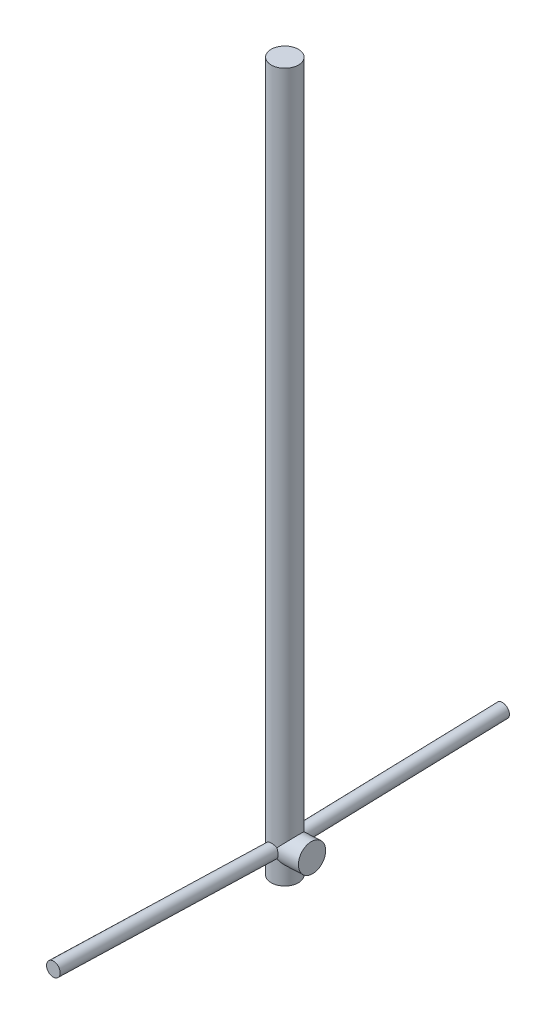
ISO-10303-21;
HEADER;
FILE_DESCRIPTION(('STEP AP214'),'2;1');
FILE_NAME('part.step','',(''),(''),'','','');
FILE_SCHEMA(('AUTOMOTIVE_DESIGN { 1 0 10303 214 1 1 1 1 }'));
ENDSEC;
DATA;
#1=APPLICATION_CONTEXT('core data for automotive mechanical design processes');
#2=APPLICATION_PROTOCOL_DEFINITION('international standard','automotive_design',2000,#1);
#3=PRODUCT_CONTEXT('',#1,'mechanical');
#4=PRODUCT('Part','Part','',(#3));
#5=PRODUCT_RELATED_PRODUCT_CATEGORY('part','',(#4));
#6=PRODUCT_DEFINITION_FORMATION('','',#4);
#7=PRODUCT_DEFINITION_CONTEXT('part definition',#1,'design');
#8=PRODUCT_DEFINITION('design','',#6,#7);
#9=PRODUCT_DEFINITION_SHAPE('','',#8);
#10=(LENGTH_UNIT() NAMED_UNIT(*) SI_UNIT(.MILLI.,.METRE.));
#11=(NAMED_UNIT(*) PLANE_ANGLE_UNIT() SI_UNIT($,.RADIAN.));
#12=(NAMED_UNIT(*) SI_UNIT($,.STERADIAN.) SOLID_ANGLE_UNIT());
#13=UNCERTAINTY_MEASURE_WITH_UNIT(LENGTH_MEASURE(1.E-05),#10,'distance_accuracy_value','');
#14=(GEOMETRIC_REPRESENTATION_CONTEXT(3) GLOBAL_UNCERTAINTY_ASSIGNED_CONTEXT((#13)) GLOBAL_UNIT_ASSIGNED_CONTEXT((#10,
#11,#12)) REPRESENTATION_CONTEXT('',''));
#15=CARTESIAN_POINT('',(0.,0.,0.));
#16=DIRECTION('',(0.,0.,1.));
#17=DIRECTION('',(1.,0.,0.));
#18=AXIS2_PLACEMENT_3D('',#15,#16,#17);
#19=CARTESIAN_POINT('',(0.,-100.,0.));
#20=DIRECTION('',(0.,1.,0.));
#21=DIRECTION('',(0.,0.,1.));
#22=AXIS2_PLACEMENT_3D('',#19,#20,#21);
#23=PLANE('',#22);
#24=CARTESIAN_POINT('',(0.,-100.,0.));
#25=DIRECTION('',(0.,1.,0.));
#26=DIRECTION('',(0.,0.,1.));
#27=AXIS2_PLACEMENT_3D('',#24,#25,#26);
#28=CIRCLE('',#27,50.);
#29=CARTESIAN_POINT('',(0.,-100.,50.));
#30=VERTEX_POINT('',#29);
#31=EDGE_CURVE('E155',#30,#30,#28,.T.);
#32=ORIENTED_EDGE('',*,*,#31,.F.);
#33=EDGE_LOOP('',(#32));
#34=FACE_BOUND('',#33,.T.);
#35=ADVANCED_FACE('F59',(#34),#23,.F.);
#36=CARTESIAN_POINT('',(0.,2500.,0.));
#37=DIRECTION('',(0.,1.,0.));
#38=DIRECTION('',(0.,0.,1.));
#39=AXIS2_PLACEMENT_3D('',#36,#37,#38);
#40=PLANE('',#39);
#41=CARTESIAN_POINT('',(0.,2500.,0.));
#42=DIRECTION('',(0.,1.,0.));
#43=DIRECTION('',(0.,0.,1.));
#44=AXIS2_PLACEMENT_3D('',#41,#42,#43);
#45=CIRCLE('',#44,50.);
#46=CARTESIAN_POINT('',(0.,2500.,50.));
#47=VERTEX_POINT('',#46);
#48=EDGE_CURVE('E158',#47,#47,#45,.T.);
#49=ORIENTED_EDGE('',*,*,#48,.T.);
#50=EDGE_LOOP('',(#49));
#51=FACE_BOUND('',#50,.T.);
#52=ADVANCED_FACE('F151',(#51),#40,.T.);
#53=CARTESIAN_POINT('',(0.,-100.,0.));
#54=DIRECTION('',(0.,1.,0.));
#55=DIRECTION('',(0.,0.,1.));
#56=AXIS2_PLACEMENT_3D('',#53,#54,#55);
#57=CYLINDRICAL_SURFACE('',#56,50.);
#58=CARTESIAN_POINT('',(0.,26.5119330554168,-50.));
#59=CARTESIAN_POINT('',(0.652167768799973,26.5119306936379,-49.9999979292977));
#60=CARTESIAN_POINT('',(1.30438425939995,26.4859875871324,-49.9872100324663));
#61=CARTESIAN_POINT('',(2.60397388038285,26.3825297546256,-49.9363844626733));
#62=CARTESIAN_POINT('',(3.25134474426769,26.3049922550804,-49.8983356396639));
#63=CARTESIAN_POINT('',(4.53716864067537,26.0991474571904,-49.7978982936412));
#64=CARTESIAN_POINT('',(5.17560460201858,25.9707538927765,-49.7354684160989));
#65=CARTESIAN_POINT('',(6.43779058405342,25.6647804984095,-49.5878876097817));
#66=CARTESIAN_POINT('',(7.06154207882814,25.4872056285046,-49.5027389722778));
#67=CARTESIAN_POINT('',(8.28778008375576,25.0857008531938,-49.3122311253799));
#68=CARTESIAN_POINT('',(8.89034451383354,24.8619676080531,-49.206957793641));
#69=CARTESIAN_POINT('',(10.0734424601174,24.3699387185465,-48.9784524443914));
#70=CARTESIAN_POINT('',(10.6539755006106,24.1016421126178,-48.855220039377));
#71=CARTESIAN_POINT('',(11.7899013718175,23.5229225225562,-48.5935993023709));
#72=CARTESIAN_POINT('',(12.3452990770038,23.2125077534485,-48.4552139269353));
#73=CARTESIAN_POINT('',(13.4285607077832,22.5518997760985,-48.1662544525045));
#74=CARTESIAN_POINT('',(13.9564236049864,22.2017050836768,-48.0156798987943));
#75=CARTESIAN_POINT('',(15.0158980621268,21.4398064917419,-47.6953737640189));
#76=CARTESIAN_POINT('',(15.5455134669685,21.0255817121601,-47.525033218668));
#77=CARTESIAN_POINT('',(16.5687734185367,20.1573112228309,-47.1780426439557));
#78=CARTESIAN_POINT('',(17.0624166797629,19.7032640912685,-47.0013923894464));
#79=CARTESIAN_POINT('',(18.0120692801017,18.7574389518345,-46.6457134653697));
#80=CARTESIAN_POINT('',(18.4680509267243,18.2656336842679,-46.4666831560923));
#81=CARTESIAN_POINT('',(19.1218539261476,17.5018055201029,-46.1996772534605));
#82=CARTESIAN_POINT('',(19.3347691219767,17.2428302305838,-46.1109278289826));
#83=CARTESIAN_POINT('',(19.7503886395436,16.7163502483625,-45.93444382413));
#84=CARTESIAN_POINT('',(19.95309001691,16.4488431320436,-45.8467095419455));
#85=CARTESIAN_POINT('',(20.5813875637761,15.5845453050621,-45.570034509098));
#86=CARTESIAN_POINT('',(20.9872540206152,14.9722730075493,-45.3840402339006));
#87=CARTESIAN_POINT('',(21.7459596218325,13.7119753093483,-45.0254307954758));
#88=CARTESIAN_POINT('',(22.09880149005,13.0639517475193,-44.8528149452278));
#89=CARTESIAN_POINT('',(22.5859259035965,12.0679949981496,-44.6083954378112));
#90=CARTESIAN_POINT('',(22.7412813241169,11.7320129765701,-44.5293376784519));
#91=CARTESIAN_POINT('',(23.0375459494284,11.0526132575428,-44.3767868207847));
#92=CARTESIAN_POINT('',(23.1784587934876,10.70919745982,-44.303292321862));
#93=CARTESIAN_POINT('',(23.5789744411638,9.66846053369845,-44.0922134145531));
#94=CARTESIAN_POINT('',(23.8164300257483,8.96049546680453,-43.9639951458506));
#95=CARTESIAN_POINT('',(24.2184881529904,7.55794134235611,-43.7437397900715));
#96=CARTESIAN_POINT('',(24.3861430175361,6.86445727034488,-43.6502126157531));
#97=CARTESIAN_POINT('',(24.6625758524223,5.46229860344192,-43.4946276059534));
#98=CARTESIAN_POINT('',(24.7713558774927,4.75362453957792,-43.4325686722362));
#99=CARTESIAN_POINT('',(24.9280007891541,3.32812253342626,-43.3428538090455));
#100=CARTESIAN_POINT('',(24.9759275327568,2.61130361958308,-43.3151629452717));
#101=CARTESIAN_POINT('',(25.0099803771014,1.17573864844611,-43.2955119765068));
#102=CARTESIAN_POINT('',(24.9961138034914,0.456992829684517,-43.3035476361069));
#103=CARTESIAN_POINT('',(24.9123755759359,-0.882626871715813,-43.3517626663436));
#104=CARTESIAN_POINT('',(24.8499767969008,-1.50413985653053,-43.3876517465877));
#105=CARTESIAN_POINT('',(24.6789781688036,-2.73867440470225,-43.4851438802463));
#106=CARTESIAN_POINT('',(24.5703829418161,-3.35169681122956,-43.5467443611566));
#107=CARTESIAN_POINT('',(24.3081079978967,-4.56523402177804,-43.693688486364));
#108=CARTESIAN_POINT('',(24.154417430049,-5.16574577817606,-43.7790378448996));
#109=CARTESIAN_POINT('',(23.8034944226802,-6.35044522573766,-43.9708264897473));
#110=CARTESIAN_POINT('',(23.606259935982,-6.934632147949,-44.0772667676054));
#111=CARTESIAN_POINT('',(23.1687197951004,-8.08693489193478,-44.3088253096788));
#112=CARTESIAN_POINT('',(22.9281629984212,-8.65493336073845,-44.4340517312747));
#113=CARTESIAN_POINT('',(22.4065872814971,-9.76870126219608,-44.6993338044282));
#114=CARTESIAN_POINT('',(22.125551462538,-10.3144612883182,-44.8393956428098));
#115=CARTESIAN_POINT('',(21.5249804602751,-11.381257142467,-45.1307719846827));
#116=CARTESIAN_POINT('',(21.205442372195,-11.9022911009147,-45.2820873368573));
#117=CARTESIAN_POINT('',(20.5297254460623,-12.9176368997563,-45.5924182584519));
#118=CARTESIAN_POINT('',(20.1735436489156,-13.4119465771563,-45.7514344491891));
#119=CARTESIAN_POINT('',(19.3813051483865,-14.429875608434,-46.0930881011026));
#120=CARTESIAN_POINT('',(18.9407949795388,-14.949855141521,-46.2762639298973));
#121=CARTESIAN_POINT('',(18.0184462797537,-15.9516032706954,-46.6431338594662));
#122=CARTESIAN_POINT('',(17.536604915746,-16.433369243049,-46.826827994932));
#123=CARTESIAN_POINT('',(16.5338110767223,-17.3565018710643,-47.1902276604949));
#124=CARTESIAN_POINT('',(16.0128409241653,-17.7978500645828,-47.3699313397096));
#125=CARTESIAN_POINT('',(14.9345469846276,-18.637433502328,-47.720863070806));
#126=CARTESIAN_POINT('',(14.3772227255243,-19.0356681864707,-47.8920910125644));
#127=CARTESIAN_POINT('',(13.1986231099025,-19.8063347870389,-48.2306103261627));
#128=CARTESIAN_POINT('',(12.5755243724736,-20.1762874542909,-48.397214333291));
#129=CARTESIAN_POINT('',(11.2958488296186,-20.8624724578426,-48.7117839183768));
#130=CARTESIAN_POINT('',(10.6392704186303,-21.1787022146328,-48.8597486012776));
#131=CARTESIAN_POINT('',(9.29738865324226,-21.7541961215275,-49.1327491995872));
#132=CARTESIAN_POINT('',(8.61210048982999,-22.013489955518,-49.2577970571694));
#133=CARTESIAN_POINT('',(7.21763097866321,-22.4724052972924,-49.4813522285945));
#134=CARTESIAN_POINT('',(6.50845197650744,-22.6720326442338,-49.5798621394343));
#135=CARTESIAN_POINT('',(5.12275560743515,-22.9972478796527,-49.7414225649732));
#136=CARTESIAN_POINT('',(4.44746364150071,-23.1270655651942,-49.8064843883572));
#137=CARTESIAN_POINT('',(3.08651546435301,-23.3315044332502,-49.9093075347069));
#138=CARTESIAN_POINT('',(2.40085971893998,-23.4061280889783,-49.9470700809363));
#139=CARTESIAN_POINT('',(1.02503230388344,-23.4992396689942,-49.9942290100139));
#140=CARTESIAN_POINT('',(0.33486242228046,-23.5177486130455,-50.0036360144325));
#141=CARTESIAN_POINT('',(-1.04447124695571,-23.498453272613,-49.9938462304826));
#142=CARTESIAN_POINT('',(-1.7336350757457,-23.4606513602802,-49.9746506470267));
#143=CARTESIAN_POINT('',(-3.05612289084397,-23.3339315048205,-49.9105865191522));
#144=CARTESIAN_POINT('',(-3.68991468065028,-23.248863683862,-49.8676527663958));
#145=CARTESIAN_POINT('',(-4.9472853540433,-23.0315161018892,-49.7586428365474));
#146=CARTESIAN_POINT('',(-5.57086483306326,-22.8992391037501,-49.6925680137702));
#147=CARTESIAN_POINT('',(-6.80377311637499,-22.5887806317137,-49.5388198418161));
#148=CARTESIAN_POINT('',(-7.41310122446478,-22.4105969202888,-49.4511454398687));
#149=CARTESIAN_POINT('',(-8.6137945159636,-22.009960993585,-49.256192752033));
#150=CARTESIAN_POINT('',(-9.20515900608312,-21.7875070722333,-49.1489137106397));
#151=CARTESIAN_POINT('',(-10.3811687481424,-21.2940772738735,-48.9142087446566));
#152=CARTESIAN_POINT('',(-10.9652750251297,-21.0220259490804,-48.7863456311498));
#153=CARTESIAN_POINT('',(-12.1080414267707,-20.435469128745,-48.5153607665895));
#154=CARTESIAN_POINT('',(-12.6667013627077,-20.120963318418,-48.3722389023996));
#155=CARTESIAN_POINT('',(-13.7560704283926,-19.4515194862596,-48.0737933177074));
#156=CARTESIAN_POINT('',(-14.2867700918102,-19.0965678979726,-47.9184655085011));
#157=CARTESIAN_POINT('',(-15.3176607495072,-18.3484066135257,-47.5989552825156));
#158=CARTESIAN_POINT('',(-15.8178501518098,-17.955194923788,-47.4347724045337));
#159=CARTESIAN_POINT('',(-16.8285912058987,-17.0959586266044,-47.0861878576822));
#160=CARTESIAN_POINT('',(-17.3361137924409,-16.6265686904145,-46.9012859867124));
#161=CARTESIAN_POINT('',(-18.3098548959485,-15.6473262183333,-46.5297844142759));
#162=CARTESIAN_POINT('',(-18.77607102419,-15.1374713456107,-46.3431846153063));
#163=CARTESIAN_POINT('',(-19.6648058745173,-14.0796009062463,-45.9731139635339));
#164=CARTESIAN_POINT('',(-20.0873098034652,-13.5315725251837,-45.7896441874254));
#165=CARTESIAN_POINT('',(-20.8860456103098,-12.39979423019,-45.4308806204945));
#166=CARTESIAN_POINT('',(-21.2622547270301,-11.8160269545178,-45.255590877527));
#167=CARTESIAN_POINT('',(-21.9783847077934,-10.5937589254514,-44.9122931529182));
#168=CARTESIAN_POINT('',(-22.3164663581239,-9.95403558943076,-44.744788735741));
#169=CARTESIAN_POINT('',(-22.9364271386976,-8.6435077335138,-44.4301832584097));
#170=CARTESIAN_POINT('',(-23.2183384702295,-7.97272129487877,-44.2830705229311));
#171=CARTESIAN_POINT('',(-23.7228737575511,-6.60473389626446,-44.0148490134831));
#172=CARTESIAN_POINT('',(-23.9455443624376,-5.90755421679697,-43.893719793448));
#173=CARTESIAN_POINT('',(-24.3289656553411,-4.49181305684654,-43.682371022842));
#174=CARTESIAN_POINT('',(-24.4897256523298,-3.77325480839422,-43.5921468255713));
#175=CARTESIAN_POINT('',(-24.7343493290202,-2.39286401898705,-43.4537644519624));
#176=CARTESIAN_POINT('',(-24.8242303296775,-1.73242082213513,-43.4023366638934));
#177=CARTESIAN_POINT('',(-24.9507550069156,-0.404810428600927,-43.3297268121219));
#178=CARTESIAN_POINT('',(-24.9874024200643,0.262356292833827,-43.3085426255647));
#179=CARTESIAN_POINT('',(-25.0071347824567,1.59756446796986,-43.297151470799));
#180=CARTESIAN_POINT('',(-24.9902331849301,2.26560565982449,-43.3069367220734));
#181=CARTESIAN_POINT('',(-24.9033706493138,3.59705637974972,-43.3569444315579));
#182=CARTESIAN_POINT('',(-24.8334110591914,4.26046602505517,-43.3971661165137));
#183=CARTESIAN_POINT('',(-24.6495673613309,5.52292369481856,-43.5018267195459));
#184=CARTESIAN_POINT('',(-24.5397837747692,6.12276574454268,-43.5639936310788));
#185=CARTESIAN_POINT('',(-24.2779339893283,7.31032686193963,-43.7104610066658));
#186=CARTESIAN_POINT('',(-24.125870750117,7.89804677509616,-43.7947599214084));
#187=CARTESIAN_POINT('',(-23.7810149522602,9.0583041807037,-43.982972461617));
#188=CARTESIAN_POINT('',(-23.5882129253769,9.63083810885248,-44.0868906462641));
#189=CARTESIAN_POINT('',(-23.1636079867222,10.7578733954785,-44.3114534637967));
#190=CARTESIAN_POINT('',(-22.9318024202973,11.3123735234743,-44.4320992350945));
#191=CARTESIAN_POINT('',(-22.4108820193561,12.4445334424839,-44.697253214086));
#192=CARTESIAN_POINT('',(-22.1186670871072,13.0205007298463,-44.8428980382244));
#193=CARTESIAN_POINT('',(-21.4928331342869,14.1461958785785,-45.1461960146171));
#194=CARTESIAN_POINT('',(-21.1592102660488,14.6959212949462,-45.3038502822743));
#195=CARTESIAN_POINT('',(-20.4523690033648,15.7671332340148,-45.6273130817839));
#196=CARTESIAN_POINT('',(-20.0791328027739,16.288606897151,-45.7931252624907));
#197=CARTESIAN_POINT('',(-19.2950134848177,17.3009988973258,-46.1289972332745));
#198=CARTESIAN_POINT('',(-18.8841282015857,17.7919154737528,-46.2990572673111));
#199=CARTESIAN_POINT('',(-17.9729735748114,18.8003384738585,-46.6609198000241));
#200=CARTESIAN_POINT('',(-17.4679464012494,19.3135337559833,-46.8527906232831));
#201=CARTESIAN_POINT('',(-16.4149346144265,20.2957163356537,-47.232013538064));
#202=CARTESIAN_POINT('',(-15.866946151001,20.7646996626368,-47.4193652226113));
#203=CARTESIAN_POINT('',(-14.7303532757037,21.6554920794949,-47.784653956403));
#204=CARTESIAN_POINT('',(-14.1417258700639,22.0772741029648,-47.9625855734465));
#205=CARTESIAN_POINT('',(-12.9271935775498,22.869910434928,-48.3040940200173));
#206=CARTESIAN_POINT('',(-12.3012912393824,23.240768219693,-48.4676718291117));
#207=CARTESIAN_POINT('',(-11.0164009631417,23.9276786498184,-48.775761013098));
#208=CARTESIAN_POINT('',(-10.3574465779076,24.2437854796204,-48.9202912042468));
#209=CARTESIAN_POINT('',(-9.01010423159929,24.8181099380938,-49.1862731816853));
#210=CARTESIAN_POINT('',(-8.32171207428873,25.0763192807378,-49.3077216642464));
#211=CARTESIAN_POINT('',(-6.92268081477836,25.5308083617607,-49.5234904554951));
#212=CARTESIAN_POINT('',(-6.21210577702277,25.7272510451267,-49.6178820829585));
#213=CARTESIAN_POINT('',(-4.77340047493405,26.0561596302901,-49.7768796154083));
#214=CARTESIAN_POINT('',(-4.04528179829827,26.1886666082961,-49.8415046430647));
#215=CARTESIAN_POINT('',(-2.76389625501451,26.3625627544944,-49.9265736377335));
#216=CARTESIAN_POINT('',(-2.21302361204858,26.4185262665434,-49.9540603451265));
#217=CARTESIAN_POINT('',(-1.10811243970777,26.4932130521429,-49.9907747156895));
#218=CARTESIAN_POINT('',(-0.55407380353912,26.5119350619554,-50.0000017592435));
#219=CARTESIAN_POINT('',(0.,26.5119330554168,-50.));
#220=B_SPLINE_CURVE_WITH_KNOTS('',3,(#58,#59,#60,#61,#62,#63,#64,#65,#66,#67,#68,#69,#70,#71,
#72,#73,#74,#75,#76,#77,#78,#79,#80,#81,#82,#83,#84,#85,#86,#87,#88,#89,#90,#91,#92,#93,#94,#95,
#96,#97,#98,#99,#100,#101,#102,#103,#104,#105,#106,#107,#108,#109,#110,#111,#112,#113,#114,#115,
#116,#117,#118,#119,#120,#121,#122,#123,#124,#125,#126,#127,#128,#129,#130,#131,#132,#133,#134,
#135,#136,#137,#138,#139,#140,#141,#142,#143,#144,#145,#146,#147,#148,#149,#150,#151,#152,#153,
#154,#155,#156,#157,#158,#159,#160,#161,#162,#163,#164,#165,#166,#167,#168,#169,#170,#171,#172,
#173,#174,#175,#176,#177,#178,#179,#180,#181,#182,#183,#184,#185,#186,#187,#188,#189,#190,#191,
#192,#193,#194,#195,#196,#197,#198,#199,#200,#201,#202,#203,#204,#205,#206,#207,#208,#209,#210,
#211,#212,#213,#214,#215,#216,#217,#218,#219),.UNSPECIFIED.,.T.,.F.,(4,2,2,2,2,2,2,2,2,2,2,2,2,
2,2,2,2,2,2,2,2,2,2,2,2,2,2,2,2,2,2,2,2,2,2,2,2,2,2,2,2,2,2,2,2,2,2,2,2,2,2,2,2,2,2,2,2,2,2,2,2,
2,2,2,2,2,2,2,2,2,2,2,2,2,2,2,2,2,2,2,4),(0.,1.9559513480262,3.91276661780077,5.87291550542035,
7.83286677943865,9.78463391505576,11.7364431702652,13.6878722765504,15.6393742141119,
17.7180121374634,19.7967243066197,21.876951586958,22.9171610117783,23.957668605521,
26.2280253104908,28.4982653487861,29.6334476016746,30.7683431022503,33.0376075061184,
35.1932557419495,37.3488287408763,39.5022088534514,41.6553336878525,43.5300743005909,
45.4046273847602,47.2796318974186,49.1547245804626,51.0410593405042,52.9281838805623,
54.8154508826331,56.7028704072136,58.8176007314479,60.9324761270907,63.0483127923984,
65.1641769410699,67.3919659066937,69.6198618095562,71.8465934130096,74.0731070298264,
76.1425440443135,78.2118883228737,80.2804573590126,82.3489392570794,84.2694488321524,
86.1898460295274,88.1103368462156,90.0309016885743,91.9995542368084,93.9682213826923,
95.9375508200567,97.9069829261509,100.051426528056,102.195994060808,104.341285002998,
106.487626514097,108.712763025787,110.936620218814,113.158721017772,115.380487567752,
117.383274134646,119.385920115311,121.388063006949,123.390155034757,125.227053318631,
127.063823047976,128.901020137583,130.738342320863,132.72255147059,134.706945133235,
136.692234586733,138.677638321229,140.910478886786,143.143519787397,145.37783467823,
147.611996970795,149.843935425343,152.076193101274,154.302511525818,156.527397716404,
158.189093803538,159.850846277035),.UNSPECIFIED.);
#221=CARTESIAN_POINT('',(17.4008124303877,-16.5514740985195,-46.8744250819406));
#222=VERTEX_POINT('',#221);
#223=CARTESIAN_POINT('',(17.9205923932838,18.8401869840015,-46.6781787163314));
#224=VERTEX_POINT('',#223);
#225=EDGE_CURVE('E97',#222,#224,#220,.T.);
#226=ORIENTED_EDGE('',*,*,#225,.F.);
#227=CARTESIAN_POINT('',(0.,0.,0.));
#228=DIRECTION('',(0.689202437604511,0.724568837309472,0.));
#229=DIRECTION('',(-0.724568837309472,0.689202437604511,0.));
#230=AXIS2_PLACEMENT_3D('',#227,#228,#229);
#231=ELLIPSE('',#230,69.0065559342354,50.);
#232=CARTESIAN_POINT('',(17.4008124303877,-16.5514740985195,46.8744250819406));
#233=VERTEX_POINT('',#232);
#234=EDGE_CURVE('E88',#233,#222,#231,.T.);
#235=ORIENTED_EDGE('',*,*,#234,.F.);
#236=CARTESIAN_POINT('',(0.,-23.5105821434828,50.));
#237=CARTESIAN_POINT('',(0.662490480898119,-23.5105800746508,49.9999980074405));
#238=CARTESIAN_POINT('',(1.32502602825415,-23.4846037660258,49.9868028281207));
#239=CARTESIAN_POINT('',(2.6452563638897,-23.3809752111958,49.9343503772701));
#240=CARTESIAN_POINT('',(3.30294894290374,-23.3033006991567,49.8950818762709));
#241=CARTESIAN_POINT('',(4.60939744449756,-23.0969681371741,49.7914005366495));
#242=CARTESIAN_POINT('',(5.25813657763749,-22.9682250202044,49.7269457468979));
#243=CARTESIAN_POINT('',(6.54085442471501,-22.661166232494,49.5745336545662));
#244=CARTESIAN_POINT('',(7.17483460417934,-22.4828555066421,49.4865786964081));
#245=CARTESIAN_POINT('',(8.4216283033039,-22.0791805538696,49.2896854044975));
#246=CARTESIAN_POINT('',(9.03451074028191,-21.8539907554664,49.1808249694533));
#247=CARTESIAN_POINT('',(10.2378771706798,-21.3581830202263,48.9444779050507));
#248=CARTESIAN_POINT('',(10.828360677992,-21.0875640981649,48.8169908717438));
#249=CARTESIAN_POINT('',(11.9836116127916,-20.5031091127244,48.5463180300745));
#250=CARTESIAN_POINT('',(12.5483837008202,-20.1892809234448,48.4031350829724));
#251=CARTESIAN_POINT('',(13.6495583753428,-19.5205513291474,48.104210911921));
#252=CARTESIAN_POINT('',(14.1859600068429,-19.1656485427749,47.9484692656712));
#253=CARTESIAN_POINT('',(15.2570327934333,-18.3960125176399,47.6188426061772));
#254=CARTESIAN_POINT('',(15.7899373417048,-17.9790458170183,47.4444301179029));
#255=CARTESIAN_POINT('',(16.8188132007349,-17.104148258304,47.0895287966847));
#256=CARTESIAN_POINT('',(17.3147832845061,-16.6462160404208,46.9090397621629));
#257=CARTESIAN_POINT('',(18.2675892780708,-15.6915181622297,46.5462691447213));
#258=CARTESIAN_POINT('',(18.7244077710472,-15.1947354050401,46.363986803823));
#259=CARTESIAN_POINT('',(19.5965126256346,-14.1645781509307,46.0021707434455));
#260=CARTESIAN_POINT('',(20.0117784918657,-13.6311858132746,45.8226384169944));
#261=CARTESIAN_POINT('',(20.8235796506684,-12.4947526295849,45.4597492788657));
#262=CARTESIAN_POINT('',(21.2171662998439,-11.8894383671931,45.2768961423797));
#263=CARTESIAN_POINT('',(21.9510273657429,-10.6437176252551,44.9256928206269));
#264=CARTESIAN_POINT('',(22.2913292250961,-10.0033294403268,44.7573351901573));
#265=CARTESIAN_POINT('',(22.9156004169994,-8.69110063965279,44.4409468128408));
#266=CARTESIAN_POINT('',(23.1995918283136,-8.01927247942489,44.2929081061821));
#267=CARTESIAN_POINT('',(23.7082210082207,-6.64846589779565,44.0227592179776));
#268=CARTESIAN_POINT('',(23.9328657830456,-5.94949069245368,43.9006459761073));
#269=CARTESIAN_POINT('',(24.3067446005251,-4.57814884630867,43.6946747390084));
#270=CARTESIAN_POINT('',(24.4600665852919,-3.90720300798656,43.6087806323301));
#271=CARTESIAN_POINT('',(24.7107090838339,-2.55176495342331,43.4672483317904));
#272=CARTESIAN_POINT('',(24.808032353344,-1.86727340549077,43.4116086490955));
#273=CARTESIAN_POINT('',(24.9453715181259,-0.491172850492063,43.3328367244016));
#274=CARTESIAN_POINT('',(24.985426605591,0.20043096242652,43.3096822509486));
#275=CARTESIAN_POINT('',(25.0079518145566,1.58485951802777,43.2966807625851));
#276=CARTESIAN_POINT('',(24.9904262019265,2.27768416646407,43.3068312802725));
#277=CARTESIAN_POINT('',(24.9033798538266,3.5827442872624,43.3569339163574));
#278=CARTESIAN_POINT('',(24.8397483920716,4.19551534630097,43.3935092708223));
#279=CARTESIAN_POINT('',(24.6681914873324,5.41277272623475,43.4912643601883));
#280=CARTESIAN_POINT('',(24.5602698826252,6.01725976035106,43.5524419629976));
#281=CARTESIAN_POINT('',(24.3014486340758,7.2143225866267,43.6973859082565));
#282=CARTESIAN_POINT('',(24.1505380326894,7.80689530064307,43.7811580095694));
#283=CARTESIAN_POINT('',(23.8073644180205,8.97669045919131,43.9687114634697));
#284=CARTESIAN_POINT('',(23.6150989950902,9.55391200704385,44.0724939819804));
#285=CARTESIAN_POINT('',(23.1825973134709,10.7125725790888,44.301572954682));
#286=CARTESIAN_POINT('',(22.9407683305463,11.293280283747,44.4275564126671));
#287=CARTESIAN_POINT('',(22.4161930598292,12.4325929506181,44.6945286921127));
#288=CARTESIAN_POINT('',(22.1334294169394,12.9911884093225,44.8355238713623));
#289=CARTESIAN_POINT('',(21.5289064514763,14.0838477791425,45.1289159180897));
#290=CARTESIAN_POINT('',(21.2071401742602,14.6179072917199,45.2813148171297));
#291=CARTESIAN_POINT('',(20.5264268147065,15.6593957173656,45.5939259604537));
#292=CARTESIAN_POINT('',(20.1674767915706,16.1668225193097,45.7541388221995));
#293=CARTESIAN_POINT('',(19.3640436894761,17.2186348217508,46.1004301276142));
#294=CARTESIAN_POINT('',(18.9145314434534,17.758987164848,46.2871193325921));
#295=CARTESIAN_POINT('',(17.9722502082837,18.8004000634282,46.6610669831089));
#296=CARTESIAN_POINT('',(17.4794778024519,19.3014575094746,46.8483254724803));
#297=CARTESIAN_POINT('',(16.4527490656127,20.2617042773894,47.2186930823487));
#298=CARTESIAN_POINT('',(15.9187732586003,20.7208735730324,47.4018001870071));
#299=CARTESIAN_POINT('',(14.8123114638538,21.5941008034553,47.7591184286819));
#300=CARTESIAN_POINT('',(14.2398254545899,22.0081587130146,47.9333295607248));
#301=CARTESIAN_POINT('',(13.0357587363728,22.8034310358551,48.2750021279131));
#302=CARTESIAN_POINT('',(12.4027367600964,23.1827009239983,48.4419247700005));
#303=CARTESIAN_POINT('',(11.1017500835193,23.8853693487448,48.7565273689694));
#304=CARTESIAN_POINT('',(10.433783818922,24.2087653813372,48.9042064633701));
#305=CARTESIAN_POINT('',(9.06796284544573,24.7956939106965,49.175770481192));
#306=CARTESIAN_POINT('',(8.3701315218785,25.0592722629707,49.2996736196405));
#307=CARTESIAN_POINT('',(6.94957794312251,25.5233181146861,49.5198917608405));
#308=CARTESIAN_POINT('',(6.22685905083729,25.7237941039254,49.6162104746458));
#309=CARTESIAN_POINT('',(4.83303955732965,26.0426010900217,49.7703257292625));
#310=CARTESIAN_POINT('',(4.16362336735063,26.1669599626434,49.8309279274232));
#311=CARTESIAN_POINT('',(2.81493401683596,26.3599707889085,49.9252735683049));
#312=CARTESIAN_POINT('',(2.13566149741529,26.4286263494433,49.9590187500642));
#313=CARTESIAN_POINT('',(0.773238548913212,26.509242814745,49.9986637994407));
#314=CARTESIAN_POINT('',(0.0900898776220026,26.5212276368169,50.0045754139255));
#315=CARTESIAN_POINT('',(-1.2744918413095,26.488391584413,49.9884103000534));
#316=CARTESIAN_POINT('',(-1.95592496655735,26.443573327594,49.9663348614239));
#317=CARTESIAN_POINT('',(-3.25449833666609,26.3039001181076,49.8978462958243));
#318=CARTESIAN_POINT('',(-3.87224570020916,26.2135475504599,49.8536250481957));
#319=CARTESIAN_POINT('',(-5.09718735723398,25.9867700043802,49.7433089941434));
#320=CARTESIAN_POINT('',(-5.70438238911609,25.8503482634029,49.6772157247558));
#321=CARTESIAN_POINT('',(-6.90439739746688,25.5329112402271,49.5246928880243));
#322=CARTESIAN_POINT('',(-7.49721647026223,25.3518931626416,49.4382620458961));
#323=CARTESIAN_POINT('',(-8.66500432529506,24.9470801685841,49.2470084809761));
#324=CARTESIAN_POINT('',(-9.23997229223437,24.7232833016443,49.1421849195996));
#325=CARTESIAN_POINT('',(-10.3873472248519,24.2270117311128,48.9127419233883));
#326=CARTESIAN_POINT('',(-10.9590659999157,23.9531933958463,48.7875906081399));
#327=CARTESIAN_POINT('',(-12.0774023182716,23.3644512275086,48.5228462803412));
#328=CARTESIAN_POINT('',(-12.6240195984832,23.0495269637525,48.3832531164805));
#329=CARTESIAN_POINT('',(-13.689920565477,22.3807983936189,48.0925290942402));
#330=CARTESIAN_POINT('',(-14.2091958533715,22.0269822423334,47.941394725175));
#331=CARTESIAN_POINT('',(-15.2182060930895,21.2827871929383,47.6307142538447));
#332=CARTESIAN_POINT('',(-15.7079385577997,20.892405223515,47.471167445477));
#333=CARTESIAN_POINT('',(-16.70723645488,20.033191012401,47.1293576299624));
#334=CARTESIAN_POINT('',(-17.2132350863428,19.5604393195536,46.9465017521575));
#335=CARTESIAN_POINT('',(-18.1844495977572,18.5754308981218,46.5789168195748));
#336=CARTESIAN_POINT('',(-18.6496627932376,18.0631715733355,46.3941876423892));
#337=CARTESIAN_POINT('',(-19.5374950833672,17.0012695161347,46.0273519107812));
#338=CARTESIAN_POINT('',(-19.9600815169052,16.4515986505546,45.8452474576524));
#339=CARTESIAN_POINT('',(-20.5598601203877,15.6014755963529,45.5778467390212));
#340=CARTESIAN_POINT('',(-20.7541088338952,15.3138215775121,45.489669595));
#341=CARTESIAN_POINT('',(-21.1310442429876,14.7301642092993,45.3158035425117));
#342=CARTESIAN_POINT('',(-21.3137271611566,14.4341581773072,45.2301154518698));
#343=CARTESIAN_POINT('',(-21.8654212339361,13.4976642155271,44.96749731422));
#344=CARTESIAN_POINT('',(-22.2136028388115,12.8431807794749,44.7960259499964));
#345=CARTESIAN_POINT('',(-22.8530445273566,11.5021997021087,44.4732145264084));
#346=CARTESIAN_POINT('',(-23.1443106220322,10.8157054510419,44.3218723416851));
#347=CARTESIAN_POINT('',(-23.5359251757871,9.76573083089094,44.1144188610471));
#348=CARTESIAN_POINT('',(-23.6588893003055,9.41246351163065,44.0485425559171));
#349=CARTESIAN_POINT('',(-23.8893731527313,8.69975140992059,43.9239687057886));
#350=CARTESIAN_POINT('',(-23.9968968455806,8.34030824000498,43.8652693184099));
#351=CARTESIAN_POINT('',(-24.1961241510468,7.61589013486147,43.7556912295224));
#352=CARTESIAN_POINT('',(-24.2878281607324,7.25091533872575,43.7048123317254));
#353=CARTESIAN_POINT('',(-24.4550485026405,6.51622251768086,43.6114632105696));
#354=CARTESIAN_POINT('',(-24.5305641810338,6.14650430182905,43.5689933268471));
#355=CARTESIAN_POINT('',(-24.7198652778284,5.10018693985551,43.4620327429403));
#356=CARTESIAN_POINT('',(-24.8147072712129,4.41896478635685,43.4077900891893));
#357=CARTESIAN_POINT('',(-24.948262884135,3.04936313466442,43.3311677175765));
#358=CARTESIAN_POINT('',(-24.9869801575211,2.36098410533868,43.3087859255008));
#359=CARTESIAN_POINT('',(-25.0074735136785,0.983409742294516,43.2969563904326));
#360=CARTESIAN_POINT('',(-24.9892782006106,0.294214992615271,43.30749210316));
#361=CARTESIAN_POINT('',(-24.8960422234048,-1.0790037113094,43.361157398658));
#362=CARTESIAN_POINT('',(-24.8210048677036,-1.76302796415846,43.4042850844436));
#363=CARTESIAN_POINT('',(-24.6261719183964,-3.04655274668183,43.5150851241391));
#364=CARTESIAN_POINT('',(-24.5120837956933,-3.64720509494559,43.5796045314651));
#365=CARTESIAN_POINT('',(-24.2406171686999,-4.83567430151358,43.7311860312577));
#366=CARTESIAN_POINT('',(-24.0832425204562,-5.4234922980943,43.818246115717));
#367=CARTESIAN_POINT('',(-23.7266578531148,-6.58302578171814,44.0123489327204));
#368=CARTESIAN_POINT('',(-23.5274379954914,-7.15473744597147,44.1193963639734));
#369=CARTESIAN_POINT('',(-23.0888792742456,-8.27901356113698,44.3504796628947));
#370=CARTESIAN_POINT('',(-22.8495378551489,-8.83157678971531,44.4745166125893));
#371=CARTESIAN_POINT('',(-22.318612884037,-9.94419831161486,44.7434098233352));
#372=CARTESIAN_POINT('',(-22.0249121346492,-10.503061791927,44.8890269567754));
#373=CARTESIAN_POINT('',(-21.3968952380463,-11.5945123247698,45.1917514839593));
#374=CARTESIAN_POINT('',(-21.062561552329,-12.1270878901186,45.3488638276834));
#375=CARTESIAN_POINT('',(-20.3552577625791,-13.163782074093,45.6707178192928));
#376=CARTESIAN_POINT('',(-19.9822736524885,-13.6678902738183,45.8354622208246));
#377=CARTESIAN_POINT('',(-19.1998544094259,-14.6453289836388,46.168672689279));
#378=CARTESIAN_POINT('',(-18.7904316465336,-15.1186698448257,46.337137478724));
#379=CARTESIAN_POINT('',(-17.886290676447,-16.0871325611556,46.6941528247067));
#380=CARTESIAN_POINT('',(-17.3872139985563,-16.5781900598,46.8827182198318));
#381=CARTESIAN_POINT('',(-16.3482823423861,-17.5171737500478,47.2550334350261));
#382=CARTESIAN_POINT('',(-15.8084240567579,-17.9650964367444,47.438782862894));
#383=CARTESIAN_POINT('',(-14.6904023483459,-18.8153642610432,47.7968280605849));
#384=CARTESIAN_POINT('',(-14.1122158145288,-19.2176814960946,47.9711180092409));
#385=CARTESIAN_POINT('',(-12.9209706818491,-19.9735973190953,48.3056020629429));
#386=CARTESIAN_POINT('',(-12.3079137786202,-20.3271982731037,48.4657968524279));
#387=CARTESIAN_POINT('',(-11.0413076097232,-20.9875997039016,48.7700707395247));
#388=CARTESIAN_POINT('',(-10.3872992741853,-21.2936451522524,48.9138817228515));
#389=CARTESIAN_POINT('',(-9.05125803164798,-21.849715939738,49.1786383275988));
#390=CARTESIAN_POINT('',(-8.3692211148017,-22.0997332300803,49.2995806634067));
#391=CARTESIAN_POINT('',(-6.98394513950268,-22.5403824359626,49.5147922225387));
#392=CARTESIAN_POINT('',(-6.28076079816631,-22.7311552067355,49.6091246617579));
#393=CARTESIAN_POINT('',(-4.85771729916175,-23.0516762007691,49.7686108034435));
#394=CARTESIAN_POINT('',(-4.13786814418532,-23.1814600833886,49.833781555277));
#395=CARTESIAN_POINT('',(-2.84828684761198,-23.35660775008,49.9220169656292));
#396=CARTESIAN_POINT('',(-2.28061188163998,-23.4143016082483,49.9512099684497));
#397=CARTESIAN_POINT('',(-1.14196915297358,-23.4912901323432,49.9902025644442));
#398=CARTESIAN_POINT('',(-0.571001315828027,-23.5105839266116,50.0000017173893));
#399=CARTESIAN_POINT('',(0.,-23.5105821434828,50.));
#400=B_SPLINE_CURVE_WITH_KNOTS('',3,(#236,#237,#238,#239,#240,#241,#242,#243,#244,#245,#246,
#247,#248,#249,#250,#251,#252,#253,#254,#255,#256,#257,#258,#259,#260,#261,#262,#263,#264,#265,
#266,#267,#268,#269,#270,#271,#272,#273,#274,#275,#276,#277,#278,#279,#280,#281,#282,#283,#284,
#285,#286,#287,#288,#289,#290,#291,#292,#293,#294,#295,#296,#297,#298,#299,#300,#301,#302,#303,
#304,#305,#306,#307,#308,#309,#310,#311,#312,#313,#314,#315,#316,#317,#318,#319,#320,#321,#322,
#323,#324,#325,#326,#327,#328,#329,#330,#331,#332,#333,#334,#335,#336,#337,#338,#339,#340,#341,
#342,#343,#344,#345,#346,#347,#348,#349,#350,#351,#352,#353,#354,#355,#356,#357,#358,#359,#360,
#361,#362,#363,#364,#365,#366,#367,#368,#369,#370,#371,#372,#373,#374,#375,#376,#377,#378,#379,
#380,#381,#382,#383,#384,#385,#386,#387,#388,#389,#390,#391,#392,#393,#394,#395,#396,#397,#398,
#399),.UNSPECIFIED.,.T.,.F.,(4,2,2,2,2,2,2,2,2,2,2,2,2,2,2,2,2,2,2,2,2,2,2,2,2,2,2,2,2,2,2,2,2,
2,2,2,2,2,2,2,2,2,2,2,2,2,2,2,2,2,2,2,2,2,2,2,2,2,2,2,2,2,2,2,2,2,2,2,2,2,2,2,2,2,2,2,2,2,2,2,2,
4),(0.,1.98691335495715,3.97468300534084,5.96577776221147,7.95667395774301,9.94029071397125,
11.9239504945884,13.9072492667186,15.8906147573487,17.9846483281886,20.0787514332161,
22.17378132868,24.2698395331504,26.5014674303808,28.731942191546,30.9615406689212,
33.1908758108668,35.268677293155,37.3463765166716,39.4226531591262,41.4987759839835,
43.348096206429,45.1972561967276,47.046887945198,48.896627496554,50.8193109623331,
52.742811989992,54.6666565071566,56.5906532941962,58.7700068038827,60.949532593906,
63.1300949874287,65.3106586000405,67.5773934951689,69.8442299486597,72.109322758464,
74.3741106920672,76.4220208960268,78.4697984834701,80.5167117501682,82.5635306923803,
84.4390191230827,86.3143757835544,88.1898500250321,90.0654097977977,92.0018147113872,
93.9382399151711,95.8752565190126,97.8124359670018,99.9587523866759,102.105209969623,
104.253299895723,105.327417846609,106.401884816226,108.681486651355,110.960847601094,
112.099923684833,113.238706740645,114.377461209226,115.516261662205,117.582833455617,
119.649270704406,121.714669532571,123.779948155414,125.622232736531,127.464353256529,
129.306907376403,131.149578899236,133.091339552901,135.033941330532,136.977249542242,
138.919900543942,141.092726323473,143.265728506641,145.440053091618,147.614272036445,
149.820096284264,152.026237209578,154.22709210073,156.426658576487,158.139142635591,
159.851665566605),.UNSPECIFIED.);
#401=CARTESIAN_POINT('',(17.9205923932838,18.8401869840015,46.6781787163314));
#402=VERTEX_POINT('',#401);
#403=EDGE_CURVE('E136',#402,#233,#400,.T.);
#404=ORIENTED_EDGE('',*,*,#403,.F.);
#405=CARTESIAN_POINT('',(0.,0.,0.));
#406=DIRECTION('',(-0.724568837309472,0.689202437604511,0.));
#407=DIRECTION('',(0.689202437604511,0.724568837309472,0.));
#408=AXIS2_PLACEMENT_3D('',#405,#406,#407);
#409=ELLIPSE('',#408,72.5476250110012,50.);
#410=EDGE_CURVE('E81',#224,#402,#409,.F.);
#411=ORIENTED_EDGE('',*,*,#410,.F.);
#412=EDGE_LOOP('',(#226,#235,#404,#411));
#413=FACE_BOUND('',#412,.T.);
#414=ORIENTED_EDGE('',*,*,#48,.F.);
#415=EDGE_LOOP('',(#414));
#416=FACE_BOUND('',#415,.T.);
#417=ORIENTED_EDGE('',*,*,#31,.T.);
#418=EDGE_LOOP('',(#417));
#419=FACE_BOUND('',#418,.T.);
#420=ADVANCED_FACE('F98',(#413,#416,#419),#57,.T.);
#421=CARTESIAN_POINT('',(0.,25.5,849.61741389875));
#422=DIRECTION('',(0.,-0.03,-0.999549898704412));
#423=DIRECTION('',(0.,0.999549898704412,-0.03));
#424=AXIS2_PLACEMENT_3D('',#421,#422,#423);
#425=PLANE('',#424);
#426=CARTESIAN_POINT('',(0.,25.5,849.61741389875));
#427=DIRECTION('',(0.,-0.03,-0.999549898704412));
#428=DIRECTION('',(0.,0.999549898704412,-0.03));
#429=AXIS2_PLACEMENT_3D('',#426,#427,#428);
#430=CIRCLE('',#429,25.);
#431=CARTESIAN_POINT('',(0.,50.4887474676103,848.86741389875));
#432=VERTEX_POINT('',#431);
#433=EDGE_CURVE('E94',#432,#432,#430,.T.);
#434=ORIENTED_EDGE('',*,*,#433,.F.);
#435=EDGE_LOOP('',(#434));
#436=FACE_BOUND('',#435,.T.);
#437=ADVANCED_FACE('F128',(#436),#425,.F.);
#438=CARTESIAN_POINT('',(0.,25.5,849.61741389875));
#439=DIRECTION('',(0.,-0.03,-0.999549898704412));
#440=DIRECTION('',(0.,0.999549898704412,-0.03));
#441=AXIS2_PLACEMENT_3D('',#438,#439,#440);
#442=CYLINDRICAL_SURFACE('',#441,25.);
#443=CARTESIAN_POINT('',(-1.31430537269157,26.2532292577825,42.5328173875847));
#444=CARTESIAN_POINT('',(-0.987533116694657,26.2704317252661,42.5322886630513));
#445=CARTESIAN_POINT('',(-0.660427926522776,26.2813179755689,42.5356849312607));
#446=CARTESIAN_POINT('',(-0.0062268737946417,26.2904778680348,42.5502381974148));
#447=CARTESIAN_POINT('',(0.32086898857567,26.2887520403859,42.5613948691088));
#448=CARTESIAN_POINT('',(0.974207738266956,26.2727138583988,42.5913706626697));
#449=CARTESIAN_POINT('',(1.30045101958445,26.2584090556683,42.6101851836167));
#450=CARTESIAN_POINT('',(1.95160811985207,26.2173036475673,42.6552911513282));
#451=CARTESIAN_POINT('',(2.27652193031148,26.1905029625165,42.6815826457692));
#452=CARTESIAN_POINT('',(3.24460554590923,26.0918827591637,42.7709932529783));
#453=CARTESIAN_POINT('',(3.8850440215533,26.0017460984897,42.8448335071796));
#454=CARTESIAN_POINT('',(5.15367398039346,25.7736929933456,43.0186699489979));
#455=CARTESIAN_POINT('',(5.78186406010643,25.6357711069944,43.1186691153284));
#456=CARTESIAN_POINT('',(7.02075034870729,25.3141091423485,43.3413635069331));
#457=CARTESIAN_POINT('',(7.63148178018594,25.1304698277314,43.4640086676584));
#458=CARTESIAN_POINT('',(8.83352127343219,24.7190100013741,43.7285286829943));
#459=CARTESIAN_POINT('',(9.42482957582102,24.4911900372024,43.8704032992712));
#460=CARTESIAN_POINT('',(10.5860754119817,23.992834395326,44.1697841394874));
#461=CARTESIAN_POINT('',(11.1559814049847,23.7222385171009,44.3273122755307));
#462=CARTESIAN_POINT('',(12.2711774222707,23.1403225065699,44.6539604283636));
#463=CARTESIAN_POINT('',(12.8164648788146,22.8289981393789,44.8230816497125));
#464=CARTESIAN_POINT('',(13.9237581655143,22.140255348859,45.1832162005106));
#465=CARTESIAN_POINT('',(14.4834848667907,21.7595139874964,45.3748888295971));
#466=CARTESIAN_POINT('',(15.5690383595933,20.9543881776694,45.7625423704935));
#467=CARTESIAN_POINT('',(16.094863661876,20.5300018140602,45.9585234710624));
#468=CARTESIAN_POINT('',(17.1102409762814,19.6394367416529,46.3502514426922));
#469=CARTESIAN_POINT('',(17.5997827326523,19.1732462983563,46.5459982322578));
#470=CARTESIAN_POINT('',(18.5398093675629,18.2012289370393,46.9327503694696));
#471=CARTESIAN_POINT('',(18.9902954005268,17.6954031914164,47.1237558571419));
#472=CARTESIAN_POINT('',(19.8790502010754,16.6102089767446,47.509581476867));
#473=CARTESIAN_POINT('',(20.3143518955277,16.0281753766935,47.703761706304));
#474=CARTESIAN_POINT('',(21.1337348133084,14.8243952643442,48.0768301830381));
#475=CARTESIAN_POINT('',(21.5178130481654,14.2026464381133,48.2557175379021));
#476=CARTESIAN_POINT('',(22.2309066248504,12.92349649771,48.5934023869818));
#477=CARTESIAN_POINT('',(22.5599480704896,12.2661124822418,48.7522093964826));
#478=CARTESIAN_POINT('',(23.1595454780655,10.9199923334484,49.0455204281495));
#479=CARTESIAN_POINT('',(23.4301076646451,10.2312595464024,49.1800270366457));
#480=CARTESIAN_POINT('',(23.8924304170472,8.87761232534401,49.4124821513959));
#481=CARTESIAN_POINT('',(24.088416633441,8.21446889030703,49.5123459172863));
#482=CARTESIAN_POINT('',(24.4247592090622,6.87080840601737,49.6854939620868));
#483=CARTESIAN_POINT('',(24.5651179659881,6.19029210692964,49.7587793865859));
#484=CARTESIAN_POINT('',(24.7884471496791,4.81782540460808,49.8770369177557));
#485=CARTESIAN_POINT('',(24.8714463762175,4.12588091833374,49.9220232321693));
#486=CARTESIAN_POINT('',(24.9791907003584,2.73621628039818,49.9828406779914));
#487=CARTESIAN_POINT('',(25.0039394419109,2.03849649276028,49.9986736331203));
#488=CARTESIAN_POINT('',(24.9954330550915,0.704868478222146,50.0010570358646));
#489=CARTESIAN_POINT('',(24.9670922985407,0.0689258928299055,49.9900625661847));
#490=CARTESIAN_POINT('',(24.8623214345615,-1.1980843314064,49.9444223217008));
#491=CARTESIAN_POINT('',(24.7858947466807,-1.82915231366937,49.9097782286838));
#492=CARTESIAN_POINT('',(24.5859213221471,-3.08209705803612,49.817994175271));
#493=CARTESIAN_POINT('',(24.4623740299612,-3.70397371168801,49.7608539496544));
#494=CARTESIAN_POINT('',(24.1695422246181,-4.93454382742478,49.625723095059));
#495=CARTESIAN_POINT('',(24.0002560852528,-5.5432368199438,49.5477317247354));
#496=CARTESIAN_POINT('',(23.615177848646,-6.75152890137989,49.3718304836958));
#497=CARTESIAN_POINT('',(23.3988164340914,-7.35091081909179,49.2736776791658));
#498=CARTESIAN_POINT('',(22.9228604693633,-8.52912766262216,49.0605664965647));
#499=CARTESIAN_POINT('',(22.6632659902184,-9.10796262219575,48.9456081461039));
#500=CARTESIAN_POINT('',(22.1028068995806,-10.2423596540936,48.701591843542));
#501=CARTESIAN_POINT('',(21.8019320589366,-10.7979159133432,48.5725303983544));
#502=CARTESIAN_POINT('',(21.1609726568642,-11.8831342367836,48.3032612799328));
#503=CARTESIAN_POINT('',(20.8208842019667,-12.4127937222694,48.1630525003242));
#504=CARTESIAN_POINT('',(20.0695362880748,-13.4927359943006,47.8609407862383));
#505=CARTESIAN_POINT('',(19.654587781869,-14.0402323418976,47.6982401774736));
#506=CARTESIAN_POINT('',(18.7825412273151,-15.0988290254632,47.3674328433953));
#507=CARTESIAN_POINT('',(18.3254406221382,-15.6099271502802,47.1993257905453));
#508=CARTESIAN_POINT('',(17.371021889072,-16.5936209649954,46.8619684589948));
#509=CARTESIAN_POINT('',(16.8736684406956,-17.0661820939402,46.6927172983605));
#510=CARTESIAN_POINT('',(15.8414318597559,-17.969739530741,46.3578081545879));
#511=CARTESIAN_POINT('',(15.3065496893312,-18.4007369035114,46.1921500794747));
#512=CARTESIAN_POINT('',(14.1651813234512,-19.2455178444154,45.8584916251516));
#513=CARTESIAN_POINT('',(13.5562993380387,-19.656296849158,45.6910558972875));
#514=CARTESIAN_POINT('',(12.3016827556359,-20.4243163898761,45.3714404819205));
#515=CARTESIAN_POINT('',(11.6559433392457,-20.7815499021095,45.2192627967314));
#516=CARTESIAN_POINT('',(10.3328907237407,-21.4381444859172,44.9362962264505));
#517=CARTESIAN_POINT('',(9.65564627967028,-21.7376248602847,44.8054633366868));
#518=CARTESIAN_POINT('',(8.27315506784328,-22.2759380807604,44.5703349230403));
#519=CARTESIAN_POINT('',(7.56792010474037,-22.5147961857832,44.4660283466498));
#520=CARTESIAN_POINT('',(6.39320066907627,-22.8540935774298,44.3206067599613));
#521=CARTESIAN_POINT('',(5.9302140158566,-22.9734113836379,44.2702595857376));
#522=CARTESIAN_POINT('',(4.99693302901025,-23.1851226885965,44.1833595025693));
#523=CARTESIAN_POINT('',(4.52664073355595,-23.2775235595876,44.1468028157573));
#524=CARTESIAN_POINT('',(3.57966031842317,-23.4349547009928,44.0882018936178));
#525=CARTESIAN_POINT('',(3.10296156241009,-23.4999315342195,44.0661859449906));
#526=CARTESIAN_POINT('',(2.14592638951757,-23.6018965829603,44.0371798685905));
#527=CARTESIAN_POINT('',(1.66558852779038,-23.6388730220916,44.0301960607506));
#528=CARTESIAN_POINT('',(1.18456375162296,-23.6616424056895,44.030937843562));
#529=B_SPLINE_CURVE_WITH_KNOTS('',3,(#443,#444,#445,#446,#447,#448,#449,#450,#451,#452,#453,
#454,#455,#456,#457,#458,#459,#460,#461,#462,#463,#464,#465,#466,#467,#468,#469,#470,#471,#472,
#473,#474,#475,#476,#477,#478,#479,#480,#481,#482,#483,#484,#485,#486,#487,#488,#489,#490,#491,
#492,#493,#494,#495,#496,#497,#498,#499,#500,#501,#502,#503,#504,#505,#506,#507,#508,#509,#510,
#511,#512,#513,#514,#515,#516,#517,#518,#519,#520,#521,#522,#523,#524,#525,#526,#527,#528),
.UNSPECIFIED.,.F.,.F.,(4,2,2,2,2,2,2,2,2,2,2,2,2,2,2,2,2,2,2,2,2,2,2,2,2,2,2,2,2,2,2,2,2,2,2,2,
2,2,2,2,2,2,4),(0.,0.981581085441089,1.96312090729962,2.94407187773425,3.92502910330141,
5.87518899059544,7.82557103920273,9.77169181990967,11.7177884822203,13.666648767557,
15.6157118536615,17.7241556607177,19.8326920258955,21.94182212586,24.0508898620701,
26.3048958658669,28.559033315068,30.8120985820973,33.0649239103673,35.1580974283019,
37.2511807148109,39.3432123154844,41.4351130423759,43.342860780753,45.2504728682867,
47.1581074465006,49.0658098580645,50.9980112536153,52.9302094747442,54.8628873565299,
56.7957572969169,58.9114134733683,61.027198064136,63.1448597411774,65.2624671467075,
67.5195800722501,69.7769888122556,72.0296831785847,74.2814373891708,75.7228122641468,
77.1637919910549,78.6075667229941,80.0519483397878),.UNSPECIFIED.);
#530=EDGE_CURVE('E72',#402,#233,#529,.T.);
#531=ORIENTED_EDGE('',*,*,#530,.F.);
#532=ORIENTED_EDGE('',*,*,#403,.T.);
#533=EDGE_LOOP('',(#531,#532));
#534=FACE_BOUND('',#533,.T.);
#535=ORIENTED_EDGE('',*,*,#433,.T.);
#536=EDGE_LOOP('',(#535));
#537=FACE_BOUND('',#536,.T.);
#538=ADVANCED_FACE('F141',(#534,#537),#442,.T.);
#539=CARTESIAN_POINT('',(99.8749217771909,5.,0.));
#540=DIRECTION('',(0.998749217771909,0.05,0.));
#541=DIRECTION('',(-0.05,0.998749217771909,0.));
#542=AXIS2_PLACEMENT_3D('',#539,#540,#541);
#543=PLANE('',#542);
#544=CARTESIAN_POINT('',(99.8749217771909,5.,0.));
#545=DIRECTION('',(0.998749217771909,0.05,0.));
#546=DIRECTION('',(-0.05,0.998749217771909,0.));
#547=AXIS2_PLACEMENT_3D('',#544,#545,#546);
#548=CIRCLE('',#547,50.);
#549=CARTESIAN_POINT('',(97.3749217771909,54.9374608885954,0.));
#550=VERTEX_POINT('',#549);
#551=EDGE_CURVE('E101',#550,#550,#548,.T.);
#552=ORIENTED_EDGE('',*,*,#551,.T.);
#553=EDGE_LOOP('',(#552));
#554=FACE_BOUND('',#553,.T.);
#555=ADVANCED_FACE('F108',(#554),#543,.T.);
#556=CARTESIAN_POINT('',(0.,0.,0.));
#557=DIRECTION('',(0.998749217771909,0.05,0.));
#558=DIRECTION('',(-0.05,0.998749217771909,0.));
#559=AXIS2_PLACEMENT_3D('',#556,#557,#558);
#560=CYLINDRICAL_SURFACE('',#559,50.);
#561=CARTESIAN_POINT('',(-1.91312464582376,26.2146348703328,-42.5381343350255));
#562=CARTESIAN_POINT('',(-1.58939352023606,26.2393423139602,-42.5328817683856));
#563=CARTESIAN_POINT('',(-1.26513072465761,26.257844778102,-42.531486093958));
#564=CARTESIAN_POINT('',(-0.616201948961535,26.2824325585368,-42.5363656488764));
#565=CARTESIAN_POINT('',(-0.291535981401794,26.2885182523351,-42.5426406450029));
#566=CARTESIAN_POINT('',(0.357384324134194,26.2882668739669,-42.5628129241096));
#567=CARTESIAN_POINT('',(0.681638789559174,26.2819364764583,-42.5767061088021));
#568=CARTESIAN_POINT('',(1.32923941908846,26.2569190352544,-42.6119732467259));
#569=CARTESIAN_POINT('',(1.65258558101621,26.2382319619741,-42.6333472178679));
#570=CARTESIAN_POINT('',(2.61663203549751,26.1640268070444,-42.7081369303151));
#571=CARTESIAN_POINT('',(3.25522294484883,26.0903609704048,-42.7723451425637));
#572=CARTESIAN_POINT('',(4.52174645460215,25.8955159218957,-42.9274355937428));
#573=CARTESIAN_POINT('',(5.14967805859794,25.7743322934166,-43.018320311962));
#574=CARTESIAN_POINT('',(6.38970369290296,25.4862054290336,-43.2236125974141));
#575=CARTESIAN_POINT('',(7.00182573759212,25.3193502265568,-43.3379748060779));
#576=CARTESIAN_POINT('',(8.20800272915455,24.9414830194819,-43.5869118531204));
#577=CARTESIAN_POINT('',(8.80205775495014,24.7304712078054,-43.7214866031892));
#578=CARTESIAN_POINT('',(9.97002180048547,24.2657505022728,-44.0073678873127));
#579=CARTESIAN_POINT('',(10.5439019420415,24.0119831938971,-44.158697213921));
#580=CARTESIAN_POINT('',(11.6681929298008,23.4637149749181,-44.4741469643717));
#581=CARTESIAN_POINT('',(12.2186026790265,23.1692121631111,-44.6382679850707));
#582=CARTESIAN_POINT('',(13.3356614529699,22.516686831214,-44.9886581156624));
#583=CARTESIAN_POINT('',(13.9002368459486,22.1555036553624,-45.1756566789232));
#584=CARTESIAN_POINT('',(14.997087921006,21.3897631910636,-45.5554810476297));
#585=CARTESIAN_POINT('',(15.5293622769891,20.9852041237347,-45.7483070918321));
#586=CARTESIAN_POINT('',(16.5593506833767,20.1344937725491,-46.1353480670276));
#587=CARTESIAN_POINT('',(17.0570534613433,19.6883290327593,-46.3295634284667));
#588=CARTESIAN_POINT('',(18.01522672403,18.7564604854852,-46.7149635229006));
#589=CARTESIAN_POINT('',(18.4756970571993,18.2707565170769,-46.9061482435569));
#590=CARTESIAN_POINT('',(19.3923374714747,17.2211786811895,-47.2964081951548));
#591=CARTESIAN_POINT('',(19.8451742308791,16.6541596219347,-47.494878756774));
#592=CARTESIAN_POINT('',(20.7009132448904,15.4792292818156,-47.8782940889592));
#593=CARTESIAN_POINT('',(21.1038122758644,14.8713153649672,-48.063237986022));
#594=CARTESIAN_POINT('',(21.855885190161,13.6183476480018,-48.4146976314479));
#595=CARTESIAN_POINT('',(22.2050798559936,12.9733083481327,-48.5812205013397));
#596=CARTESIAN_POINT('',(22.8462517638621,11.6501431423468,-48.8914451164181));
#597=CARTESIAN_POINT('',(23.1382345903442,10.9720204737751,-49.0351490886968));
#598=CARTESIAN_POINT('',(23.6454868673401,9.63022546082335,-49.2878041790691));
#599=CARTESIAN_POINT('',(23.8643616419452,8.96821544452666,-49.3983456417136));
#600=CARTESIAN_POINT('',(24.2461314231657,7.62444660881776,-49.5931366984284));
#601=CARTESIAN_POINT('',(24.4090283664891,6.94268847353149,-49.677387202098));
#602=CARTESIAN_POINT('',(24.6767669301196,5.5653880160599,-49.8175157249148));
#603=CARTESIAN_POINT('',(24.7816412770669,4.86985369388649,-49.8734097365698));
#604=CARTESIAN_POINT('',(24.9321783767944,3.47069486676929,-49.9556576343009));
#605=CARTESIAN_POINT('',(24.9778455061134,2.76707096367872,-49.9820137037727));
#606=CARTESIAN_POINT('',(25.008051623312,1.42365918698887,-50.003790310141));
#607=CARTESIAN_POINT('',(24.997884579827,0.78402533862315,-50.0018618894367));
#608=CARTESIAN_POINT('',(24.9287613770836,-0.492024715033073,-49.9738317144313));
#609=CARTESIAN_POINT('',(24.869808829678,-1.1284411550163,-49.9477317496623));
#610=CARTESIAN_POINT('',(24.7039191754589,-2.39356274430875,-49.872329189168));
#611=CARTESIAN_POINT('',(24.5969826346103,-3.0222679844807,-49.8230268671113));
#612=CARTESIAN_POINT('',(24.3363865108764,-4.26779588705661,-49.7027161593358));
#613=CARTESIAN_POINT('',(24.1827255065767,-4.88461818736014,-49.6317071132722));
#614=CARTESIAN_POINT('',(23.8298645967156,-6.10404632757848,-49.4697291805142));
#615=CARTESIAN_POINT('',(23.6305538345683,-6.70661355437033,-49.3787117270835));
#616=CARTESIAN_POINT('',(23.1884704997941,-7.89255123830114,-49.1791433729437));
#617=CARTESIAN_POINT('',(22.9456983088149,-8.47592186395788,-49.0705926262006));
#618=CARTESIAN_POINT('',(22.418609142324,-9.62063886554635,-48.8385350871009));
#619=CARTESIAN_POINT('',(22.1342823615549,-10.1819800036153,-48.7150247660514));
#620=CARTESIAN_POINT('',(21.5261292980501,-11.2799171140044,-48.4558896179073));
#621=CARTESIAN_POINT('',(21.2023008503444,-11.8165117278173,-48.320264126925));
#622=CARTESIAN_POINT('',(20.4859771374495,-12.9101849275857,-48.0271492580296));
#623=CARTESIAN_POINT('',(20.0899167425715,-13.4646991818332,-47.8687928314071));
#624=CARTESIAN_POINT('',(19.2555829806343,-14.5388724899436,-47.5452871761365));
#625=CARTESIAN_POINT('',(18.8173072782514,-15.0585296128319,-47.3801375719841));
#626=CARTESIAN_POINT('',(17.9004083214181,-16.0609767346854,-47.0471154222206));
#627=CARTESIAN_POINT('',(17.4217510103158,-16.5437349468949,-46.8792406766274));
#628=CARTESIAN_POINT('',(16.6756225145533,-17.2378450174802,-46.6288534633106));
#629=CARTESIAN_POINT('',(16.4222128516068,-17.4642181982336,-46.545625537498));
#630=CARTESIAN_POINT('',(15.9061771813016,-17.9067547345122,-46.3801706145659));
#631=CARTESIAN_POINT('',(15.6435484395232,-18.1229150154778,-46.2979439243255));
#632=CARTESIAN_POINT('',(14.8026167509903,-18.7868759781415,-46.0415392487134));
#633=CARTESIAN_POINT('',(14.2081757933827,-19.2155956043813,-45.8702140685914));
#634=CARTESIAN_POINT('',(12.981418159903,-20.0207416953404,-45.5407360617026));
#635=CARTESIAN_POINT('',(12.3491042710138,-20.3971720011621,-45.3825822677257));
#636=CARTESIAN_POINT('',(11.3756011887536,-20.9196255054958,-45.1597451247256));
#637=CARTESIAN_POINT('',(11.0471733189934,-21.0866396856199,-45.0879115067957));
#638=CARTESIAN_POINT('',(10.3823834412152,-21.4062859577587,-44.9496960133599));
#639=CARTESIAN_POINT('',(10.046023386565,-21.5589215453223,-44.883312813321));
#640=CARTESIAN_POINT('',(9.02581072618225,-21.9945965338085,-44.6933807788227));
#641=CARTESIAN_POINT('',(8.33056642611045,-22.2555435432191,-44.5789892506266));
#642=CARTESIAN_POINT('',(7.05987091385248,-22.6679548425148,-44.4001190161027));
#643=CARTESIAN_POINT('',(6.48885530024434,-22.8308928971847,-44.3302198138399));
#644=CARTESIAN_POINT('',(5.33456910616266,-23.1154999555384,-44.2113001393232));
#645=CARTESIAN_POINT('',(4.75130132083186,-23.2371782657054,-44.1622749581193));
#646=CARTESIAN_POINT('',(3.573444767524,-23.4384825788577,-44.0865112862572));
#647=CARTESIAN_POINT('',(2.97881807230067,-23.5179252906875,-44.0598696488641));
#648=CARTESIAN_POINT('',(2.08325554770801,-23.6043563464,-44.0375446612184));
#649=CARTESIAN_POINT('',(1.78401728745639,-23.6277138266104,-44.0330442122871));
#650=CARTESIAN_POINT('',(1.18484821013746,-23.6634626783542,-44.0299512779871));
#651=CARTESIAN_POINT('',(0.884917375171465,-23.6758537632219,-44.0313589470532));
#652=CARTESIAN_POINT('',(0.58486881219771,-23.6827453731098,-44.0357298118804));
#653=B_SPLINE_CURVE_WITH_KNOTS('',3,(#561,#562,#563,#564,#565,#566,#567,#568,#569,#570,#571,
#572,#573,#574,#575,#576,#577,#578,#579,#580,#581,#582,#583,#584,#585,#586,#587,#588,#589,#590,
#591,#592,#593,#594,#595,#596,#597,#598,#599,#600,#601,#602,#603,#604,#605,#606,#607,#608,#609,
#610,#611,#612,#613,#614,#615,#616,#617,#618,#619,#620,#621,#622,#623,#624,#625,#626,#627,#628,
#629,#630,#631,#632,#633,#634,#635,#636,#637,#638,#639,#640,#641,#642,#643,#644,#645,#646,#647,
#648,#649,#650,#651,#652),.UNSPECIFIED.,.F.,.F.,(4,2,2,2,2,2,2,2,2,2,2,2,2,2,2,2,2,2,2,2,2,2,2,
2,2,2,2,2,2,2,2,2,2,2,2,2,2,2,2,2,2,2,2,2,2,4),(0.,0.974055008317899,1.9480804021426,
2.92158232169932,3.89508657207118,5.83048218514286,7.76605772900253,9.69792834699163,
11.6297905247608,13.5643138282409,15.4989274500971,17.5842073706106,19.6695728429336,
21.7556151101545,23.8416658679659,26.0957284924846,28.3499365479325,30.6032700632266,
32.8563835210091,34.9713824954417,37.0863082882579,39.2000399745293,41.313615406947,
43.2304666257965,45.1471759425539,47.063862652569,48.980607676332,50.9020576543813,
52.8234907604374,54.7453779837254,56.6673705873602,58.7638862867408,60.860518030697,
62.9589360351985,64.0082214789005,65.0578208195978,67.3128586544856,69.5677307496546,
70.6935484625979,71.8190917702223,74.0692806161199,75.8612547303624,77.6528243804518,
79.452106775547,80.3524281196854,81.2527729978546),.UNSPECIFIED.);
#654=EDGE_CURVE('E12',#224,#222,#653,.T.);
#655=ORIENTED_EDGE('',*,*,#654,.F.);
#656=ORIENTED_EDGE('',*,*,#410,.T.);
#657=ORIENTED_EDGE('',*,*,#530,.T.);
#658=ORIENTED_EDGE('',*,*,#234,.T.);
#659=EDGE_LOOP('',(#655,#656,#657,#658));
#660=FACE_BOUND('',#659,.T.);
#661=ORIENTED_EDGE('',*,*,#551,.F.);
#662=EDGE_LOOP('',(#661));
#663=FACE_BOUND('',#662,.T.);
#664=ADVANCED_FACE('F90',(#660,#663),#560,.T.);
#665=CARTESIAN_POINT('',(0.,24.,-799.63991896353));
#666=DIRECTION('',(0.,0.03,-0.999549898704412));
#667=DIRECTION('',(0.,0.999549898704412,0.03));
#668=AXIS2_PLACEMENT_3D('',#665,#666,#667);
#669=PLANE('',#668);
#670=CARTESIAN_POINT('',(0.,24.,-799.63991896353));
#671=DIRECTION('',(0.,0.03,-0.999549898704412));
#672=DIRECTION('',(0.,0.999549898704412,0.03));
#673=AXIS2_PLACEMENT_3D('',#670,#671,#672);
#674=CIRCLE('',#673,25.);
#675=CARTESIAN_POINT('',(0.,48.9887474676103,-798.88991896353));
#676=VERTEX_POINT('',#675);
#677=EDGE_CURVE('E102',#676,#676,#674,.T.);
#678=ORIENTED_EDGE('',*,*,#677,.T.);
#679=EDGE_LOOP('',(#678));
#680=FACE_BOUND('',#679,.T.);
#681=ADVANCED_FACE('F107',(#680),#669,.T.);
#682=CARTESIAN_POINT('',(0.,0.,0.));
#683=DIRECTION('',(0.,0.03,-0.999549898704412));
#684=DIRECTION('',(0.,0.999549898704412,0.03));
#685=AXIS2_PLACEMENT_3D('',#682,#683,#684);
#686=CYLINDRICAL_SURFACE('',#685,25.);
#687=ORIENTED_EDGE('',*,*,#654,.T.);
#688=ORIENTED_EDGE('',*,*,#225,.T.);
#689=EDGE_LOOP('',(#687,#688));
#690=FACE_BOUND('',#689,.T.);
#691=ORIENTED_EDGE('',*,*,#677,.F.);
#692=EDGE_LOOP('',(#691));
#693=FACE_BOUND('',#692,.T.);
#694=ADVANCED_FACE('F104',(#690,#693),#686,.T.);
#695=CLOSED_SHELL('',(#35,#52,#420,#437,#538,#555,#664,#681,#694));
#696=MANIFOLD_SOLID_BREP('B2',#695);
#697=ADVANCED_BREP_SHAPE_REPRESENTATION('',(#18,#696),#14);
#698=SHAPE_DEFINITION_REPRESENTATION(#9,#697);
ENDSEC;
END-ISO-10303-21;
